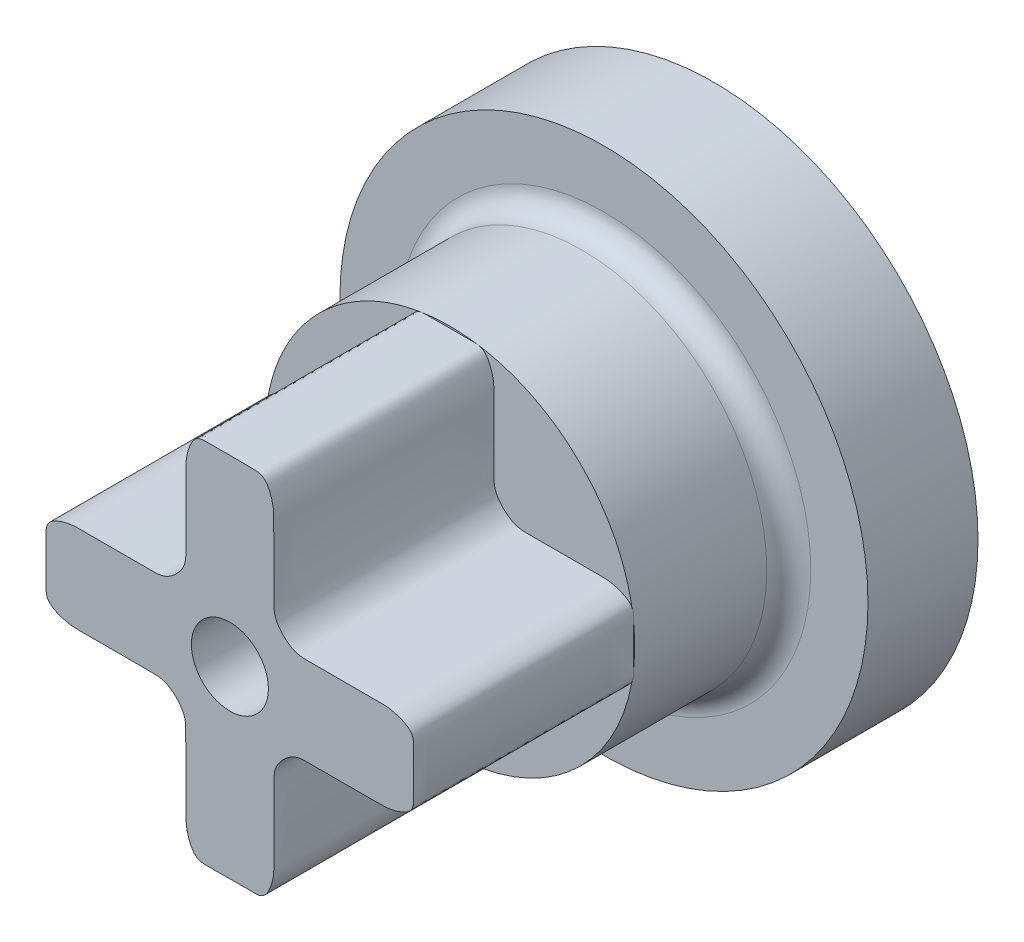
ISO-10303-21;
HEADER;
FILE_DESCRIPTION(('STEP AP214'),'2;1');
FILE_NAME('part.step','',(''),(''),'','','');
FILE_SCHEMA(('AUTOMOTIVE_DESIGN { 1 0 10303 214 1 1 1 1 }'));
ENDSEC;
DATA;
#1=APPLICATION_CONTEXT('core data for automotive mechanical design processes');
#2=APPLICATION_PROTOCOL_DEFINITION('international standard','automotive_design',2000,#1);
#3=PRODUCT_CONTEXT('',#1,'mechanical');
#4=PRODUCT('Part','Part','',(#3));
#5=PRODUCT_RELATED_PRODUCT_CATEGORY('part','',(#4));
#6=PRODUCT_DEFINITION_FORMATION('','',#4);
#7=PRODUCT_DEFINITION_CONTEXT('part definition',#1,'design');
#8=PRODUCT_DEFINITION('design','',#6,#7);
#9=PRODUCT_DEFINITION_SHAPE('','',#8);
#10=(LENGTH_UNIT() NAMED_UNIT(*) SI_UNIT(.MILLI.,.METRE.));
#11=(NAMED_UNIT(*) PLANE_ANGLE_UNIT() SI_UNIT($,.RADIAN.));
#12=(NAMED_UNIT(*) SI_UNIT($,.STERADIAN.) SOLID_ANGLE_UNIT());
#13=UNCERTAINTY_MEASURE_WITH_UNIT(LENGTH_MEASURE(1.E-05),#10,'distance_accuracy_value','');
#14=(GEOMETRIC_REPRESENTATION_CONTEXT(3) GLOBAL_UNCERTAINTY_ASSIGNED_CONTEXT((#13)) GLOBAL_UNIT_ASSIGNED_CONTEXT((#10,
#11,#12)) REPRESENTATION_CONTEXT('',''));
#15=CARTESIAN_POINT('',(0.,0.,0.));
#16=DIRECTION('',(0.,0.,1.));
#17=DIRECTION('',(1.,0.,0.));
#18=AXIS2_PLACEMENT_3D('',#15,#16,#17);
#19=CARTESIAN_POINT('',(0.,0.,12.));
#20=DIRECTION('',(0.,0.,-1.));
#21=DIRECTION('',(-1.,0.,0.));
#22=AXIS2_PLACEMENT_3D('',#19,#20,#21);
#23=CYLINDRICAL_SURFACE('',#22,8.4);
#24=CARTESIAN_POINT('',(0.,0.,6.));
#25=DIRECTION('',(0.,0.,-1.));
#26=DIRECTION('',(-1.,0.,0.));
#27=AXIS2_PLACEMENT_3D('',#24,#25,#26);
#28=CIRCLE('',#27,8.4);
#29=CARTESIAN_POINT('',(-8.4,0.,6.));
#30=VERTEX_POINT('',#29);
#31=EDGE_CURVE('E11',#30,#30,#28,.F.);
#32=ORIENTED_EDGE('',*,*,#31,.T.);
#33=EDGE_LOOP('',(#32));
#34=FACE_BOUND('',#33,.T.);
#35=CARTESIAN_POINT('',(0.,0.,12.));
#36=DIRECTION('',(0.,0.,1.));
#37=DIRECTION('',(1.,0.,0.));
#38=AXIS2_PLACEMENT_3D('',#35,#36,#37);
#39=CIRCLE('',#38,8.4);
#40=CARTESIAN_POINT('',(8.34734035095152,0.939100135968743,12.));
#41=VERTEX_POINT('',#40);
#42=CARTESIAN_POINT('',(8.27049185518825,1.46934151008704,12.));
#43=VERTEX_POINT('',#42);
#44=EDGE_CURVE('E105',#41,#43,#39,.T.);
#45=ORIENTED_EDGE('',*,*,#44,.F.);
#46=CARTESIAN_POINT('',(8.34734035095152,-0.93910013596874,12.));
#47=VERTEX_POINT('',#46);
#48=EDGE_CURVE('E121',#47,#41,#39,.T.);
#49=ORIENTED_EDGE('',*,*,#48,.F.);
#50=CARTESIAN_POINT('',(8.27049185518826,-1.46934151008699,12.));
#51=VERTEX_POINT('',#50);
#52=EDGE_CURVE('E64',#51,#47,#39,.T.);
#53=ORIENTED_EDGE('',*,*,#52,.F.);
#54=CARTESIAN_POINT('',(1.49637230364592,-8.26564395125277,12.));
#55=VERTEX_POINT('',#54);
#56=EDGE_CURVE('E192',#55,#51,#39,.T.);
#57=ORIENTED_EDGE('',*,*,#56,.F.);
#58=CARTESIAN_POINT('',(0.839169284923735,-8.35797792000198,12.));
#59=VERTEX_POINT('',#58);
#60=EDGE_CURVE('E191',#59,#55,#39,.T.);
#61=ORIENTED_EDGE('',*,*,#60,.F.);
#62=CARTESIAN_POINT('',(-0.839169284923728,-8.35797792000198,12.));
#63=VERTEX_POINT('',#62);
#64=EDGE_CURVE('E200',#63,#59,#39,.T.);
#65=ORIENTED_EDGE('',*,*,#64,.F.);
#66=CARTESIAN_POINT('',(-1.4963723036459,-8.26564395125277,12.));
#67=VERTEX_POINT('',#66);
#68=EDGE_CURVE('E205',#67,#63,#39,.T.);
#69=ORIENTED_EDGE('',*,*,#68,.F.);
#70=CARTESIAN_POINT('',(-8.26578421475585,-1.49559731047268,12.));
#71=VERTEX_POINT('',#70);
#72=EDGE_CURVE('E207',#71,#67,#39,.T.);
#73=ORIENTED_EDGE('',*,*,#72,.F.);
#74=CARTESIAN_POINT('',(-8.3576436184383,-0.842492223808336,12.));
#75=VERTEX_POINT('',#74);
#76=EDGE_CURVE('E212',#75,#71,#39,.T.);
#77=ORIENTED_EDGE('',*,*,#76,.F.);
#78=CARTESIAN_POINT('',(-8.3576436184383,0.842492223808398,12.));
#79=VERTEX_POINT('',#78);
#80=EDGE_CURVE('E108',#79,#75,#39,.T.);
#81=ORIENTED_EDGE('',*,*,#80,.F.);
#82=CARTESIAN_POINT('',(-8.26578421475582,1.49559731047276,12.));
#83=VERTEX_POINT('',#82);
#84=EDGE_CURVE('E101',#83,#79,#39,.T.);
#85=ORIENTED_EDGE('',*,*,#84,.F.);
#86=EDGE_CURVE('E93',#43,#83,#39,.T.);
#87=ORIENTED_EDGE('',*,*,#86,.F.);
#88=EDGE_LOOP('',(#45,#49,#53,#57,#61,#65,#69,#73,#77,#81,#85,#87));
#89=FACE_BOUND('',#88,.T.);
#90=ADVANCED_FACE('F41',(#34,#89),#23,.T.);
#91=CARTESIAN_POINT('',(0.,0.,12.));
#92=DIRECTION('',(0.,0.,1.));
#93=DIRECTION('',(1.,0.,0.));
#94=AXIS2_PLACEMENT_3D('',#91,#92,#93);
#95=PLANE('',#94);
#96=CARTESIAN_POINT('',(-0.999999999999998,8.3167022270642,12.));
#97=CARTESIAN_POINT('',(-1.20768552435297,8.3167022270642,12.));
#98=CARTESIAN_POINT('',(-1.62305657305892,8.3167022270642,12.));
#99=CARTESIAN_POINT('',(-2.,7.36058324335707,12.));
#100=CARTESIAN_POINT('',(-2.,6.94521219465112,12.));
#101=CARTESIAN_POINT('',(-2.,6.73752667029815,12.));
#102=CARTESIAN_POINT('',(-2.,5.68474296578745,12.));
#103=CARTESIAN_POINT('',(-2.,4.63195926127675,12.));
#104=CARTESIAN_POINT('',(-2.,3.57917555676605,12.));
#105=CARTESIAN_POINT('',(-2.,3.33022659420497,12.));
#106=CARTESIAN_POINT('',(-2.,2.83232866908282,12.));
#107=CARTESIAN_POINT('',(-2.84256401692634,2.,12.));
#108=CARTESIAN_POINT('',(-3.3404619420485,2.,12.));
#109=CARTESIAN_POINT('',(-3.58941090460957,2.,12.));
#110=CARTESIAN_POINT('',(-4.64901817434929,2.,12.));
#111=CARTESIAN_POINT('',(-5.70862544408901,2.,12.));
#112=CARTESIAN_POINT('',(-6.76823271382872,2.,12.));
#113=CARTESIAN_POINT('',(-6.97687994472134,2.,12.));
#114=CARTESIAN_POINT('',(-7.39417440650658,2.,12.));
#115=CARTESIAN_POINT('',(-8.3576436184383,1.62594169267786,12.));
#116=CARTESIAN_POINT('',(-8.3576436184383,1.20864723089262,12.));
#117=CARTESIAN_POINT('',(-8.3576436184383,1.,12.));
#118=CARTESIAN_POINT('',(-8.3576436184383,0.333333333333334,12.));
#119=CARTESIAN_POINT('',(-8.3576436184383,-0.333333333333333,12.));
#120=CARTESIAN_POINT('',(-8.3576436184383,-1.,12.));
#121=CARTESIAN_POINT('',(-8.3576436184383,-1.20864723089262,12.));
#122=CARTESIAN_POINT('',(-8.3576436184383,-1.62594169267786,12.));
#123=CARTESIAN_POINT('',(-7.39417440650658,-2.,12.));
#124=CARTESIAN_POINT('',(-6.97687994472134,-2.,12.));
#125=CARTESIAN_POINT('',(-6.76823271382872,-2.,12.));
#126=CARTESIAN_POINT('',(-5.70862544408901,-2.,12.));
#127=CARTESIAN_POINT('',(-4.64901817434929,-2.,12.));
#128=CARTESIAN_POINT('',(-3.58941090460957,-2.,12.));
#129=CARTESIAN_POINT('',(-3.33965250961123,-2.,12.));
#130=CARTESIAN_POINT('',(-2.84013571961455,-2.,12.));
#131=CARTESIAN_POINT('',(-2.,-2.84021929500548,12.));
#132=CARTESIAN_POINT('',(-2.,-3.33973608500216,12.));
#133=CARTESIAN_POINT('',(-2.,-3.5894944800005,12.));
#134=CARTESIAN_POINT('',(-2.,-4.64915746666749,12.));
#135=CARTESIAN_POINT('',(-2.,-5.70882045333448,12.));
#136=CARTESIAN_POINT('',(-2.,-6.76848344000148,12.));
#137=CARTESIAN_POINT('',(-2.,-6.97713853085162,12.));
#138=CARTESIAN_POINT('',(-2.,-7.3944487125519,12.));
#139=CARTESIAN_POINT('',(-1.62596527255041,-8.35797792000198,12.));
#140=CARTESIAN_POINT('',(-1.20865509085013,-8.35797792000198,12.));
#141=CARTESIAN_POINT('',(-0.999999999999995,-8.35797792000198,12.));
#142=CARTESIAN_POINT('',(-0.333333333333327,-8.35797792000198,12.));
#143=CARTESIAN_POINT('',(0.33333333333334,-8.35797792000198,12.));
#144=CARTESIAN_POINT('',(1.00000000000001,-8.35797792000198,12.));
#145=CARTESIAN_POINT('',(1.20865509085015,-8.35797792000198,12.));
#146=CARTESIAN_POINT('',(1.62596527255042,-8.35797792000198,12.));
#147=CARTESIAN_POINT('',(2.00000000000001,-7.3944487125519,12.));
#148=CARTESIAN_POINT('',(2.00000000000001,-6.97713853085162,12.));
#149=CARTESIAN_POINT('',(2.00000000000001,-6.76848344000149,12.));
#150=CARTESIAN_POINT('',(2.00000000000001,-5.70882045333449,12.));
#151=CARTESIAN_POINT('',(2.00000000000001,-4.64915746666749,12.));
#152=CARTESIAN_POINT('',(2.00000000000001,-3.58949448000049,12.));
#153=CARTESIAN_POINT('',(2.00000000000001,-3.33993837290631,12.));
#154=CARTESIAN_POINT('',(2.00000000000001,-2.84082615871796,12.));
#155=CARTESIAN_POINT('',(2.83816676645535,-2.,12.));
#156=CARTESIAN_POINT('',(3.33727898064371,-2.,12.));
#157=CARTESIAN_POINT('',(3.58683508773789,-2.,12.));
#158=CARTESIAN_POINT('',(4.64472514622981,-2.,12.));
#159=CARTESIAN_POINT('',(5.70261520472173,-2.,12.));
#160=CARTESIAN_POINT('',(6.76050526321365,-2.,12.));
#161=CARTESIAN_POINT('',(6.96891030555911,-2.,12.));
#162=CARTESIAN_POINT('',(7.38572039025003,-2.,12.));
#163=CARTESIAN_POINT('',(8.34734035095153,-1.62521512703638,12.));
#164=CARTESIAN_POINT('',(8.34734035095153,-1.20840504234546,12.));
#165=CARTESIAN_POINT('',(8.34734035095153,-0.999999999999998,12.));
#166=CARTESIAN_POINT('',(8.34734035095153,-0.333333333333332,12.));
#167=CARTESIAN_POINT('',(8.34734035095153,0.333333333333335,12.));
#168=CARTESIAN_POINT('',(8.34734035095153,1.,12.));
#169=CARTESIAN_POINT('',(8.34734035095153,1.20840504234546,12.));
#170=CARTESIAN_POINT('',(8.34734035095153,1.62521512703638,12.));
#171=CARTESIAN_POINT('',(7.38572039025003,2.,12.));
#172=CARTESIAN_POINT('',(6.96891030555911,2.,12.));
#173=CARTESIAN_POINT('',(6.76050526321365,2.,12.));
#174=CARTESIAN_POINT('',(5.70261520472173,2.,12.));
#175=CARTESIAN_POINT('',(4.64472514622981,2.,12.));
#176=CARTESIAN_POINT('',(3.58683508773789,2.,12.));
#177=CARTESIAN_POINT('',(3.33808907133543,2.,12.));
#178=CARTESIAN_POINT('',(2.84059703853051,2.,12.));
#179=CARTESIAN_POINT('',(2.00000000000001,2.83293750755868,12.));
#180=CARTESIAN_POINT('',(2.00000000000001,3.33042954036359,12.));
#181=CARTESIAN_POINT('',(2.00000000000001,3.57917555676605,12.));
#182=CARTESIAN_POINT('',(2.,4.63195926127675,12.));
#183=CARTESIAN_POINT('',(2.,5.68474296578745,12.));
#184=CARTESIAN_POINT('',(2.,6.73752667029815,12.));
#185=CARTESIAN_POINT('',(2.,6.94521219465112,12.));
#186=CARTESIAN_POINT('',(2.,7.36058324335707,12.));
#187=CARTESIAN_POINT('',(1.62305657305892,8.3167022270642,12.));
#188=CARTESIAN_POINT('',(1.20768552435298,8.3167022270642,12.));
#189=CARTESIAN_POINT('',(1.,8.3167022270642,12.));
#190=CARTESIAN_POINT('',(0.333333333333335,8.3167022270642,12.));
#191=CARTESIAN_POINT('',(-0.333333333333332,8.3167022270642,12.));
#192=CARTESIAN_POINT('',(-0.999999999999998,8.3167022270642,12.));
#193=B_SPLINE_CURVE_WITH_KNOTS('',3,(#96,#97,#98,#99,#100,#101,#102,#103,#104,#105,#106,#107,
#108,#109,#110,#111,#112,#113,#114,#115,#116,#117,#118,#119,#120,#121,#122,#123,#124,#125,#126,
#127,#128,#129,#130,#131,#132,#133,#134,#135,#136,#137,#138,#139,#140,#141,#142,#143,#144,#145,
#146,#147,#148,#149,#150,#151,#152,#153,#154,#155,#156,#157,#158,#159,#160,#161,#162,#163,#164,
#165,#166,#167,#168,#169,#170,#171,#172,#173,#174,#175,#176,#177,#178,#179,#180,#181,#182,#183,
#184,#185,#186,#187,#188,#189,#190,#191,#192),.UNSPECIFIED.,.T.,.F.,(4,1,1,3,3,1,1,3,3,1,1,3,3,
1,1,3,3,1,1,3,3,1,1,3,3,1,1,3,3,1,1,3,3,1,1,3,3,1,1,3,3,1,1,3,3,1,1,3,4),(0.,0.0108633837717949,
0.0217267675435897,0.0325901513153846,0.0876579922081087,0.100679738082389,0.11370148395667,
0.126723229830951,0.182147990196063,0.193061677845553,0.203975365495042,0.214889053144532,
0.249760312807071,0.26067400045656,0.27158768810605,0.28250137575554,0.337926136120652,
0.350990220887981,0.36405430565531,0.377118390422639,0.43254606516691,0.443460163946328,
0.454374262725747,0.465288361505166,0.500159621167706,0.511073719947125,0.521987818726543,
0.532901917505962,0.588329592250233,0.601383095966513,0.614436599682794,0.627490103399074,
0.68282504178521,0.693726061305127,0.704627080825043,0.71552810034496,0.7503993600075,
0.761300379527416,0.772201399047333,0.78310241856725,0.838437356953386,0.851448487345374,
0.864459617737363,0.877470748129352,0.932538589022076,0.943401972793871,0.954265356565666,
0.965128740337461,1.),.UNSPECIFIED.);
#194=EDGE_CURVE('E129',#79,#75,#193,.T.);
#195=ORIENTED_EDGE('',*,*,#194,.F.);
#196=ORIENTED_EDGE('',*,*,#80,.T.);
#197=EDGE_LOOP('',(#195,#196));
#198=FACE_BOUND('',#197,.T.);
#199=ADVANCED_FACE('F165',(#198),#95,.T.);
#200=EDGE_CURVE('E186',#71,#67,#193,.T.);
#201=ORIENTED_EDGE('',*,*,#200,.F.);
#202=ORIENTED_EDGE('',*,*,#72,.T.);
#203=EDGE_LOOP('',(#201,#202));
#204=FACE_BOUND('',#203,.T.);
#205=ADVANCED_FACE('F180',(#204),#95,.T.);
#206=EDGE_CURVE('E218',#63,#59,#193,.T.);
#207=ORIENTED_EDGE('',*,*,#206,.F.);
#208=ORIENTED_EDGE('',*,*,#64,.T.);
#209=EDGE_LOOP('',(#207,#208));
#210=FACE_BOUND('',#209,.T.);
#211=ADVANCED_FACE('F425',(#210),#95,.T.);
#212=EDGE_CURVE('E222',#55,#51,#193,.T.);
#213=ORIENTED_EDGE('',*,*,#212,.F.);
#214=ORIENTED_EDGE('',*,*,#56,.T.);
#215=EDGE_LOOP('',(#213,#214));
#216=FACE_BOUND('',#215,.T.);
#217=ADVANCED_FACE('F420',(#216),#95,.T.);
#218=EDGE_CURVE('E57',#47,#41,#193,.T.);
#219=ORIENTED_EDGE('',*,*,#218,.F.);
#220=ORIENTED_EDGE('',*,*,#48,.T.);
#221=EDGE_LOOP('',(#219,#220));
#222=FACE_BOUND('',#221,.T.);
#223=ADVANCED_FACE('F161',(#222),#95,.T.);
#224=EDGE_CURVE('E100',#43,#83,#193,.T.);
#225=ORIENTED_EDGE('',*,*,#224,.F.);
#226=ORIENTED_EDGE('',*,*,#86,.T.);
#227=EDGE_LOOP('',(#225,#226));
#228=FACE_BOUND('',#227,.T.);
#229=ADVANCED_FACE('F97',(#228),#95,.T.);
#230=CARTESIAN_POINT('',(0.990845116049707,-8.35797792000198,12.));
#231=DIRECTION('',(0.,0.,1.));
#232=DIRECTION('',(1.,0.,0.));
#233=AXIS2_PLACEMENT_3D('',#230,#231,#232);
#234=PLANE('',#233);
#235=EDGE_CURVE('E117',#41,#43,#193,.T.);
#236=ORIENTED_EDGE('',*,*,#235,.F.);
#237=ORIENTED_EDGE('',*,*,#44,.T.);
#238=EDGE_LOOP('',(#236,#237));
#239=FACE_BOUND('',#238,.T.);
#240=ADVANCED_FACE('F156',(#239),#234,.F.);
#241=EDGE_CURVE('E116',#83,#79,#193,.T.);
#242=ORIENTED_EDGE('',*,*,#241,.F.);
#243=ORIENTED_EDGE('',*,*,#84,.T.);
#244=EDGE_LOOP('',(#242,#243));
#245=FACE_BOUND('',#244,.T.);
#246=ADVANCED_FACE('F119',(#245),#234,.F.);
#247=EDGE_CURVE('E125',#75,#71,#193,.T.);
#248=ORIENTED_EDGE('',*,*,#247,.F.);
#249=ORIENTED_EDGE('',*,*,#76,.T.);
#250=EDGE_LOOP('',(#248,#249));
#251=FACE_BOUND('',#250,.T.);
#252=ADVANCED_FACE('F220',(#251),#234,.F.);
#253=EDGE_CURVE('E130',#67,#63,#193,.T.);
#254=ORIENTED_EDGE('',*,*,#253,.F.);
#255=ORIENTED_EDGE('',*,*,#68,.T.);
#256=EDGE_LOOP('',(#254,#255));
#257=FACE_BOUND('',#256,.T.);
#258=ADVANCED_FACE('F226',(#257),#234,.F.);
#259=EDGE_CURVE('E131',#59,#55,#193,.T.);
#260=ORIENTED_EDGE('',*,*,#259,.F.);
#261=ORIENTED_EDGE('',*,*,#60,.T.);
#262=EDGE_LOOP('',(#260,#261));
#263=FACE_BOUND('',#262,.T.);
#264=ADVANCED_FACE('F221',(#263),#234,.F.);
#265=EDGE_CURVE('E132',#51,#47,#193,.T.);
#266=ORIENTED_EDGE('',*,*,#265,.F.);
#267=ORIENTED_EDGE('',*,*,#52,.T.);
#268=EDGE_LOOP('',(#266,#267));
#269=FACE_BOUND('',#268,.T.);
#270=ADVANCED_FACE('F160',(#269),#234,.F.);
#271=CARTESIAN_POINT('',(-0.999999999999998,8.3167022270642,22.));
#272=CARTESIAN_POINT('',(-1.20768552435297,8.3167022270642,22.));
#273=CARTESIAN_POINT('',(-1.62305657305892,8.3167022270642,22.));
#274=CARTESIAN_POINT('',(-2.,7.36058324335707,22.));
#275=CARTESIAN_POINT('',(-2.,6.94521219465112,22.));
#276=CARTESIAN_POINT('',(-2.,6.73752667029815,22.));
#277=CARTESIAN_POINT('',(-2.,5.68474296578745,22.));
#278=CARTESIAN_POINT('',(-2.,4.63195926127675,22.));
#279=CARTESIAN_POINT('',(-2.,3.57917555676605,22.));
#280=CARTESIAN_POINT('',(-2.,3.33022659420497,22.));
#281=CARTESIAN_POINT('',(-2.,2.83232866908282,22.));
#282=CARTESIAN_POINT('',(-2.84256401692634,2.,22.));
#283=CARTESIAN_POINT('',(-3.3404619420485,2.,22.));
#284=CARTESIAN_POINT('',(-3.58941090460957,2.,22.));
#285=CARTESIAN_POINT('',(-4.64901817434929,2.,22.));
#286=CARTESIAN_POINT('',(-5.70862544408901,2.,22.));
#287=CARTESIAN_POINT('',(-6.76823271382872,2.,22.));
#288=CARTESIAN_POINT('',(-6.97687994472134,2.,22.));
#289=CARTESIAN_POINT('',(-7.39417440650658,2.,22.));
#290=CARTESIAN_POINT('',(-8.3576436184383,1.62594169267786,22.));
#291=CARTESIAN_POINT('',(-8.3576436184383,1.20864723089262,22.));
#292=CARTESIAN_POINT('',(-8.3576436184383,1.,22.));
#293=CARTESIAN_POINT('',(-8.3576436184383,0.333333333333334,22.));
#294=CARTESIAN_POINT('',(-8.3576436184383,-0.333333333333333,22.));
#295=CARTESIAN_POINT('',(-8.3576436184383,-1.,22.));
#296=CARTESIAN_POINT('',(-8.3576436184383,-1.20864723089262,22.));
#297=CARTESIAN_POINT('',(-8.3576436184383,-1.62594169267786,22.));
#298=CARTESIAN_POINT('',(-7.39417440650658,-2.,22.));
#299=CARTESIAN_POINT('',(-6.97687994472134,-2.,22.));
#300=CARTESIAN_POINT('',(-6.76823271382872,-2.,22.));
#301=CARTESIAN_POINT('',(-5.70862544408901,-2.,22.));
#302=CARTESIAN_POINT('',(-4.64901817434929,-2.,22.));
#303=CARTESIAN_POINT('',(-3.58941090460957,-2.,22.));
#304=CARTESIAN_POINT('',(-3.33965250961123,-2.,22.));
#305=CARTESIAN_POINT('',(-2.84013571961455,-2.,22.));
#306=CARTESIAN_POINT('',(-2.,-2.84021929500548,22.));
#307=CARTESIAN_POINT('',(-2.,-3.33973608500216,22.));
#308=CARTESIAN_POINT('',(-2.,-3.5894944800005,22.));
#309=CARTESIAN_POINT('',(-2.,-4.64915746666749,22.));
#310=CARTESIAN_POINT('',(-2.,-5.70882045333448,22.));
#311=CARTESIAN_POINT('',(-2.,-6.76848344000148,22.));
#312=CARTESIAN_POINT('',(-2.,-6.97713853085162,22.));
#313=CARTESIAN_POINT('',(-2.,-7.3944487125519,22.));
#314=CARTESIAN_POINT('',(-1.62596527255041,-8.35797792000198,22.));
#315=CARTESIAN_POINT('',(-1.20865509085013,-8.35797792000198,22.));
#316=CARTESIAN_POINT('',(-0.999999999999995,-8.35797792000198,22.));
#317=CARTESIAN_POINT('',(-0.333333333333327,-8.35797792000198,22.));
#318=CARTESIAN_POINT('',(0.33333333333334,-8.35797792000198,22.));
#319=CARTESIAN_POINT('',(1.00000000000001,-8.35797792000198,22.));
#320=CARTESIAN_POINT('',(1.20865509085015,-8.35797792000198,22.));
#321=CARTESIAN_POINT('',(1.62596527255042,-8.35797792000198,22.));
#322=CARTESIAN_POINT('',(2.00000000000001,-7.3944487125519,22.));
#323=CARTESIAN_POINT('',(2.00000000000001,-6.97713853085162,22.));
#324=CARTESIAN_POINT('',(2.00000000000001,-6.76848344000149,22.));
#325=CARTESIAN_POINT('',(2.00000000000001,-5.70882045333449,22.));
#326=CARTESIAN_POINT('',(2.00000000000001,-4.64915746666749,22.));
#327=CARTESIAN_POINT('',(2.00000000000001,-3.58949448000049,22.));
#328=CARTESIAN_POINT('',(2.00000000000001,-3.33993837290631,22.));
#329=CARTESIAN_POINT('',(2.00000000000001,-2.84082615871796,22.));
#330=CARTESIAN_POINT('',(2.83816676645535,-2.,22.));
#331=CARTESIAN_POINT('',(3.33727898064371,-2.,22.));
#332=CARTESIAN_POINT('',(3.58683508773789,-2.,22.));
#333=CARTESIAN_POINT('',(4.64472514622981,-2.,22.));
#334=CARTESIAN_POINT('',(5.70261520472173,-2.,22.));
#335=CARTESIAN_POINT('',(6.76050526321365,-2.,22.));
#336=CARTESIAN_POINT('',(6.96891030555911,-2.,22.));
#337=CARTESIAN_POINT('',(7.38572039025003,-2.,22.));
#338=CARTESIAN_POINT('',(8.34734035095153,-1.62521512703638,22.));
#339=CARTESIAN_POINT('',(8.34734035095153,-1.20840504234546,22.));
#340=CARTESIAN_POINT('',(8.34734035095153,-0.999999999999998,22.));
#341=CARTESIAN_POINT('',(8.34734035095153,-0.333333333333332,22.));
#342=CARTESIAN_POINT('',(8.34734035095153,0.333333333333335,22.));
#343=CARTESIAN_POINT('',(8.34734035095153,1.,22.));
#344=CARTESIAN_POINT('',(8.34734035095153,1.20840504234546,22.));
#345=CARTESIAN_POINT('',(8.34734035095153,1.62521512703638,22.));
#346=CARTESIAN_POINT('',(7.38572039025003,2.,22.));
#347=CARTESIAN_POINT('',(6.96891030555911,2.,22.));
#348=CARTESIAN_POINT('',(6.76050526321365,2.,22.));
#349=CARTESIAN_POINT('',(5.70261520472173,2.,22.));
#350=CARTESIAN_POINT('',(4.64472514622981,2.,22.));
#351=CARTESIAN_POINT('',(3.58683508773789,2.,22.));
#352=CARTESIAN_POINT('',(3.33808907133543,2.,22.));
#353=CARTESIAN_POINT('',(2.84059703853051,2.,22.));
#354=CARTESIAN_POINT('',(2.00000000000001,2.83293750755868,22.));
#355=CARTESIAN_POINT('',(2.00000000000001,3.33042954036359,22.));
#356=CARTESIAN_POINT('',(2.00000000000001,3.57917555676605,22.));
#357=CARTESIAN_POINT('',(2.,4.63195926127675,22.));
#358=CARTESIAN_POINT('',(2.,5.68474296578745,22.));
#359=CARTESIAN_POINT('',(2.,6.73752667029815,22.));
#360=CARTESIAN_POINT('',(2.,6.94521219465112,22.));
#361=CARTESIAN_POINT('',(2.,7.36058324335707,22.));
#362=CARTESIAN_POINT('',(1.62305657305892,8.3167022270642,22.));
#363=CARTESIAN_POINT('',(1.20768552435298,8.3167022270642,22.));
#364=CARTESIAN_POINT('',(1.,8.3167022270642,22.));
#365=CARTESIAN_POINT('',(0.333333333333335,8.3167022270642,22.));
#366=CARTESIAN_POINT('',(-0.333333333333332,8.3167022270642,22.));
#367=CARTESIAN_POINT('',(-0.999999999999998,8.3167022270642,22.));
#368=B_SPLINE_CURVE_WITH_KNOTS('',3,(#271,#272,#273,#274,#275,#276,#277,#278,#279,#280,#281,
#282,#283,#284,#285,#286,#287,#288,#289,#290,#291,#292,#293,#294,#295,#296,#297,#298,#299,#300,
#301,#302,#303,#304,#305,#306,#307,#308,#309,#310,#311,#312,#313,#314,#315,#316,#317,#318,#319,
#320,#321,#322,#323,#324,#325,#326,#327,#328,#329,#330,#331,#332,#333,#334,#335,#336,#337,#338,
#339,#340,#341,#342,#343,#344,#345,#346,#347,#348,#349,#350,#351,#352,#353,#354,#355,#356,#357,
#358,#359,#360,#361,#362,#363,#364,#365,#366,#367),.UNSPECIFIED.,.T.,.F.,(4,1,1,3,3,1,1,3,3,1,1,
3,3,1,1,3,3,1,1,3,3,1,1,3,3,1,1,3,3,1,1,3,3,1,1,3,3,1,1,3,3,1,1,3,3,1,1,3,4),(0.,
0.0108633837717949,0.0217267675435897,0.0325901513153846,0.0876579922081087,0.100679738082389,
0.11370148395667,0.126723229830951,0.182147990196063,0.193061677845553,0.203975365495042,
0.214889053144532,0.249760312807071,0.26067400045656,0.27158768810605,0.28250137575554,
0.337926136120652,0.350990220887981,0.36405430565531,0.377118390422639,0.43254606516691,
0.443460163946328,0.454374262725747,0.465288361505166,0.500159621167706,0.511073719947125,
0.521987818726543,0.532901917505962,0.588329592250233,0.601383095966513,0.614436599682794,
0.627490103399074,0.68282504178521,0.693726061305127,0.704627080825043,0.71552810034496,
0.7503993600075,0.761300379527416,0.772201399047333,0.78310241856725,0.838437356953386,
0.851448487345374,0.864459617737363,0.877470748129352,0.932538589022076,0.943401972793871,
0.954265356565666,0.965128740337461,1.),.UNSPECIFIED.);
#369=DIRECTION('',(0.,0.,-1.));
#370=VECTOR('',#369,1.);
#371=SURFACE_OF_LINEAR_EXTRUSION('',#368,#370);
#372=CARTESIAN_POINT('',(-0.999999999999998,8.3167022270642,22.));
#373=VERTEX_POINT('',#372);
#374=EDGE_CURVE('E122',#373,#373,#368,.T.);
#375=ORIENTED_EDGE('',*,*,#374,.F.);
#376=EDGE_LOOP('',(#375));
#377=FACE_BOUND('',#376,.T.);
#378=ORIENTED_EDGE('',*,*,#241,.T.);
#379=ORIENTED_EDGE('',*,*,#194,.T.);
#380=ORIENTED_EDGE('',*,*,#247,.T.);
#381=ORIENTED_EDGE('',*,*,#200,.T.);
#382=ORIENTED_EDGE('',*,*,#253,.T.);
#383=ORIENTED_EDGE('',*,*,#206,.T.);
#384=ORIENTED_EDGE('',*,*,#259,.T.);
#385=ORIENTED_EDGE('',*,*,#212,.T.);
#386=ORIENTED_EDGE('',*,*,#265,.T.);
#387=ORIENTED_EDGE('',*,*,#218,.T.);
#388=ORIENTED_EDGE('',*,*,#235,.T.);
#389=ORIENTED_EDGE('',*,*,#224,.T.);
#390=EDGE_LOOP('',(#378,#379,#380,#381,#382,#383,#384,#385,#386,#387,#388,#389));
#391=FACE_BOUND('',#390,.T.);
#392=ADVANCED_FACE('F112',(#377,#391),#371,.F.);
#393=CARTESIAN_POINT('',(0.990845116049707,-8.35797792000198,22.));
#394=DIRECTION('',(0.,0.,1.));
#395=DIRECTION('',(1.,0.,0.));
#396=AXIS2_PLACEMENT_3D('',#393,#394,#395);
#397=PLANE('',#396);
#398=CARTESIAN_POINT('',(0.,0.,22.));
#399=DIRECTION('',(0.,0.,1.));
#400=DIRECTION('',(1.,0.,0.));
#401=AXIS2_PLACEMENT_3D('',#398,#399,#400);
#402=CIRCLE('',#401,1.75);
#403=CARTESIAN_POINT('',(1.75,0.,22.));
#404=VERTEX_POINT('',#403);
#405=EDGE_CURVE('E44',#404,#404,#402,.T.);
#406=ORIENTED_EDGE('',*,*,#405,.F.);
#407=EDGE_LOOP('',(#406));
#408=FACE_BOUND('',#407,.T.);
#409=ORIENTED_EDGE('',*,*,#374,.T.);
#410=EDGE_LOOP('',(#409));
#411=FACE_BOUND('',#410,.T.);
#412=ADVANCED_FACE('F157',(#408,#411),#397,.T.);
#413=CARTESIAN_POINT('',(0.,0.,5.));
#414=DIRECTION('',(0.,0.,-1.));
#415=DIRECTION('',(-1.,0.,0.));
#416=AXIS2_PLACEMENT_3D('',#413,#414,#415);
#417=CYLINDRICAL_SURFACE('',#416,12.);
#418=CARTESIAN_POINT('',(0.,0.,5.));
#419=DIRECTION('',(0.,0.,-1.));
#420=DIRECTION('',(-1.,0.,0.));
#421=AXIS2_PLACEMENT_3D('',#418,#419,#420);
#422=CIRCLE('',#421,12.);
#423=CARTESIAN_POINT('',(-12.,0.,5.));
#424=VERTEX_POINT('',#423);
#425=EDGE_CURVE('E135',#424,#424,#422,.T.);
#426=ORIENTED_EDGE('',*,*,#425,.T.);
#427=EDGE_LOOP('',(#426));
#428=FACE_BOUND('',#427,.T.);
#429=CARTESIAN_POINT('',(0.,0.,0.));
#430=DIRECTION('',(0.,0.,-1.));
#431=DIRECTION('',(-1.,0.,0.));
#432=AXIS2_PLACEMENT_3D('',#429,#430,#431);
#433=CIRCLE('',#432,12.);
#434=CARTESIAN_POINT('',(-12.,0.,0.));
#435=VERTEX_POINT('',#434);
#436=EDGE_CURVE('E137',#435,#435,#433,.T.);
#437=ORIENTED_EDGE('',*,*,#436,.F.);
#438=EDGE_LOOP('',(#437));
#439=FACE_BOUND('',#438,.T.);
#440=ADVANCED_FACE('F270',(#428,#439),#417,.T.);
#441=CARTESIAN_POINT('',(0.,0.,5.));
#442=DIRECTION('',(0.,0.,-1.));
#443=DIRECTION('',(-1.,0.,0.));
#444=AXIS2_PLACEMENT_3D('',#441,#442,#443);
#445=PLANE('',#444);
#446=CARTESIAN_POINT('',(0.,0.,5.));
#447=DIRECTION('',(0.,0.,-1.));
#448=DIRECTION('',(-1.,0.,0.));
#449=AXIS2_PLACEMENT_3D('',#446,#447,#448);
#450=CIRCLE('',#449,9.4);
#451=CARTESIAN_POINT('',(-9.4,0.,5.));
#452=VERTEX_POINT('',#451);
#453=EDGE_CURVE('E49',#452,#452,#450,.T.);
#454=ORIENTED_EDGE('',*,*,#453,.T.);
#455=EDGE_LOOP('',(#454));
#456=FACE_BOUND('',#455,.T.);
#457=ORIENTED_EDGE('',*,*,#425,.F.);
#458=EDGE_LOOP('',(#457));
#459=FACE_BOUND('',#458,.T.);
#460=ADVANCED_FACE('F166',(#456,#459),#445,.F.);
#461=CARTESIAN_POINT('',(0.,0.,0.));
#462=DIRECTION('',(0.,0.,1.));
#463=DIRECTION('',(1.,0.,0.));
#464=AXIS2_PLACEMENT_3D('',#461,#462,#463);
#465=PLANE('',#464);
#466=CARTESIAN_POINT('',(0.,0.,0.));
#467=DIRECTION('',(0.,0.,-1.));
#468=DIRECTION('',(-1.,0.,0.));
#469=AXIS2_PLACEMENT_3D('',#466,#467,#468);
#470=CIRCLE('',#469,10.25);
#471=CARTESIAN_POINT('',(-10.25,0.,0.));
#472=VERTEX_POINT('',#471);
#473=EDGE_CURVE('E144',#472,#472,#470,.T.);
#474=ORIENTED_EDGE('',*,*,#473,.F.);
#475=EDGE_LOOP('',(#474));
#476=FACE_BOUND('',#475,.T.);
#477=ORIENTED_EDGE('',*,*,#436,.T.);
#478=EDGE_LOOP('',(#477));
#479=FACE_BOUND('',#478,.T.);
#480=ADVANCED_FACE('F164',(#476,#479),#465,.F.);
#481=CARTESIAN_POINT('',(0.,0.,2.5));
#482=DIRECTION('',(0.,0.,-1.));
#483=DIRECTION('',(-1.,0.,0.));
#484=AXIS2_PLACEMENT_3D('',#481,#482,#483);
#485=CYLINDRICAL_SURFACE('',#484,10.25);
#486=CARTESIAN_POINT('',(0.,0.,2.5));
#487=DIRECTION('',(0.,0.,-1.));
#488=DIRECTION('',(-1.,0.,0.));
#489=AXIS2_PLACEMENT_3D('',#486,#487,#488);
#490=CIRCLE('',#489,10.25);
#491=CARTESIAN_POINT('',(-10.25,0.,2.5));
#492=VERTEX_POINT('',#491);
#493=EDGE_CURVE('E142',#492,#492,#490,.T.);
#494=ORIENTED_EDGE('',*,*,#493,.F.);
#495=EDGE_LOOP('',(#494));
#496=FACE_BOUND('',#495,.T.);
#497=ORIENTED_EDGE('',*,*,#473,.T.);
#498=EDGE_LOOP('',(#497));
#499=FACE_BOUND('',#498,.T.);
#500=ADVANCED_FACE('F170',(#496,#499),#485,.F.);
#501=CARTESIAN_POINT('',(0.,0.,2.5));
#502=DIRECTION('',(0.,0.,-1.));
#503=DIRECTION('',(-1.,0.,0.));
#504=AXIS2_PLACEMENT_3D('',#501,#502,#503);
#505=PLANE('',#504);
#506=CARTESIAN_POINT('',(0.,0.,2.5));
#507=DIRECTION('',(0.,0.,-1.));
#508=DIRECTION('',(-1.,0.,0.));
#509=AXIS2_PLACEMENT_3D('',#506,#507,#508);
#510=CIRCLE('',#509,4.5);
#511=CARTESIAN_POINT('',(-4.5,0.,2.5));
#512=VERTEX_POINT('',#511);
#513=EDGE_CURVE('E385',#512,#512,#510,.T.);
#514=ORIENTED_EDGE('',*,*,#513,.F.);
#515=EDGE_LOOP('',(#514));
#516=FACE_BOUND('',#515,.T.);
#517=ORIENTED_EDGE('',*,*,#493,.T.);
#518=EDGE_LOOP('',(#517));
#519=FACE_BOUND('',#518,.T.);
#520=ADVANCED_FACE('F306',(#516,#519),#505,.T.);
#521=CARTESIAN_POINT('',(0.,0.,5.));
#522=DIRECTION('',(0.,0.,-1.));
#523=DIRECTION('',(-1.,0.,0.));
#524=AXIS2_PLACEMENT_3D('',#521,#522,#523);
#525=CYLINDRICAL_SURFACE('',#524,4.5);
#526=CARTESIAN_POINT('',(0.,0.,5.));
#527=DIRECTION('',(0.,0.,-1.));
#528=DIRECTION('',(-1.,0.,0.));
#529=AXIS2_PLACEMENT_3D('',#526,#527,#528);
#530=CIRCLE('',#529,4.5);
#531=CARTESIAN_POINT('',(-4.5,0.,5.));
#532=VERTEX_POINT('',#531);
#533=EDGE_CURVE('E383',#532,#532,#530,.T.);
#534=ORIENTED_EDGE('',*,*,#533,.F.);
#535=EDGE_LOOP('',(#534));
#536=FACE_BOUND('',#535,.T.);
#537=ORIENTED_EDGE('',*,*,#513,.T.);
#538=EDGE_LOOP('',(#537));
#539=FACE_BOUND('',#538,.T.);
#540=ADVANCED_FACE('F317',(#536,#539),#525,.F.);
#541=CARTESIAN_POINT('',(0.,0.,5.));
#542=DIRECTION('',(0.,0.,-1.));
#543=DIRECTION('',(-1.,0.,0.));
#544=AXIS2_PLACEMENT_3D('',#541,#542,#543);
#545=PLANE('',#544);
#546=CARTESIAN_POINT('',(0.,0.,5.));
#547=DIRECTION('',(0.,0.,-1.));
#548=DIRECTION('',(-1.,0.,0.));
#549=AXIS2_PLACEMENT_3D('',#546,#547,#548);
#550=CIRCLE('',#549,3.);
#551=CARTESIAN_POINT('',(-3.,0.,5.));
#552=VERTEX_POINT('',#551);
#553=EDGE_CURVE('E380',#552,#552,#550,.T.);
#554=ORIENTED_EDGE('',*,*,#553,.F.);
#555=EDGE_LOOP('',(#554));
#556=FACE_BOUND('',#555,.T.);
#557=ORIENTED_EDGE('',*,*,#533,.T.);
#558=EDGE_LOOP('',(#557));
#559=FACE_BOUND('',#558,.T.);
#560=ADVANCED_FACE('F183',(#556,#559),#545,.T.);
#561=CARTESIAN_POINT('',(0.,0.,6.));
#562=DIRECTION('',(0.,0.,-1.));
#563=DIRECTION('',(-1.,0.,0.));
#564=AXIS2_PLACEMENT_3D('',#561,#562,#563);
#565=TOROIDAL_SURFACE('',#564,9.4,1.);
#566=ORIENTED_EDGE('',*,*,#31,.F.);
#567=EDGE_LOOP('',(#566));
#568=FACE_BOUND('',#567,.T.);
#569=ORIENTED_EDGE('',*,*,#453,.F.);
#570=EDGE_LOOP('',(#569));
#571=FACE_BOUND('',#570,.T.);
#572=ADVANCED_FACE('F43',(#568,#571),#565,.F.);
#573=CARTESIAN_POINT('',(0.,0.,8.));
#574=DIRECTION('',(0.,0.,-1.));
#575=DIRECTION('',(-1.,0.,0.));
#576=AXIS2_PLACEMENT_3D('',#573,#574,#575);
#577=CYLINDRICAL_SURFACE('',#576,3.);
#578=CARTESIAN_POINT('',(0.,0.,8.));
#579=DIRECTION('',(0.,0.,-1.));
#580=DIRECTION('',(-1.,0.,0.));
#581=AXIS2_PLACEMENT_3D('',#578,#579,#580);
#582=CIRCLE('',#581,3.);
#583=CARTESIAN_POINT('',(-3.,0.,8.));
#584=VERTEX_POINT('',#583);
#585=EDGE_CURVE('E378',#584,#584,#582,.T.);
#586=ORIENTED_EDGE('',*,*,#585,.F.);
#587=EDGE_LOOP('',(#586));
#588=FACE_BOUND('',#587,.T.);
#589=ORIENTED_EDGE('',*,*,#553,.T.);
#590=EDGE_LOOP('',(#589));
#591=FACE_BOUND('',#590,.T.);
#592=ADVANCED_FACE('F182',(#588,#591),#577,.F.);
#593=CARTESIAN_POINT('',(0.,0.,8.));
#594=DIRECTION('',(0.,0.,-1.));
#595=DIRECTION('',(-1.,0.,0.));
#596=AXIS2_PLACEMENT_3D('',#593,#594,#595);
#597=PLANE('',#596);
#598=CARTESIAN_POINT('',(0.,0.,8.));
#599=DIRECTION('',(0.,0.,-1.));
#600=DIRECTION('',(-1.,0.,0.));
#601=AXIS2_PLACEMENT_3D('',#598,#599,#600);
#602=CIRCLE('',#601,1.75);
#603=CARTESIAN_POINT('',(-1.75,0.,8.));
#604=VERTEX_POINT('',#603);
#605=EDGE_CURVE('E374',#604,#604,#602,.T.);
#606=ORIENTED_EDGE('',*,*,#605,.F.);
#607=EDGE_LOOP('',(#606));
#608=FACE_BOUND('',#607,.T.);
#609=ORIENTED_EDGE('',*,*,#585,.T.);
#610=EDGE_LOOP('',(#609));
#611=FACE_BOUND('',#610,.T.);
#612=ADVANCED_FACE('F349',(#608,#611),#597,.T.);
#613=CARTESIAN_POINT('',(0.,0.,22.5));
#614=DIRECTION('',(0.,0.,-1.));
#615=DIRECTION('',(-1.,0.,0.));
#616=AXIS2_PLACEMENT_3D('',#613,#614,#615);
#617=CYLINDRICAL_SURFACE('',#616,1.75);
#618=ORIENTED_EDGE('',*,*,#405,.T.);
#619=EDGE_LOOP('',(#618));
#620=FACE_BOUND('',#619,.T.);
#621=ORIENTED_EDGE('',*,*,#605,.T.);
#622=EDGE_LOOP('',(#621));
#623=FACE_BOUND('',#622,.T.);
#624=ADVANCED_FACE('F357',(#620,#623),#617,.F.);
#625=CLOSED_SHELL('',(#90,#199,#205,#211,#217,#223,#229,#240,#246,#252,#258,#264,#270,#392,#412,
#440,#460,#480,#500,#520,#540,#560,#572,#592,#612,#624));
#626=MANIFOLD_SOLID_BREP('B2',#625);
#627=ADVANCED_BREP_SHAPE_REPRESENTATION('',(#18,#626),#14);
#628=SHAPE_DEFINITION_REPRESENTATION(#9,#627);
ENDSEC;
END-ISO-10303-21;
